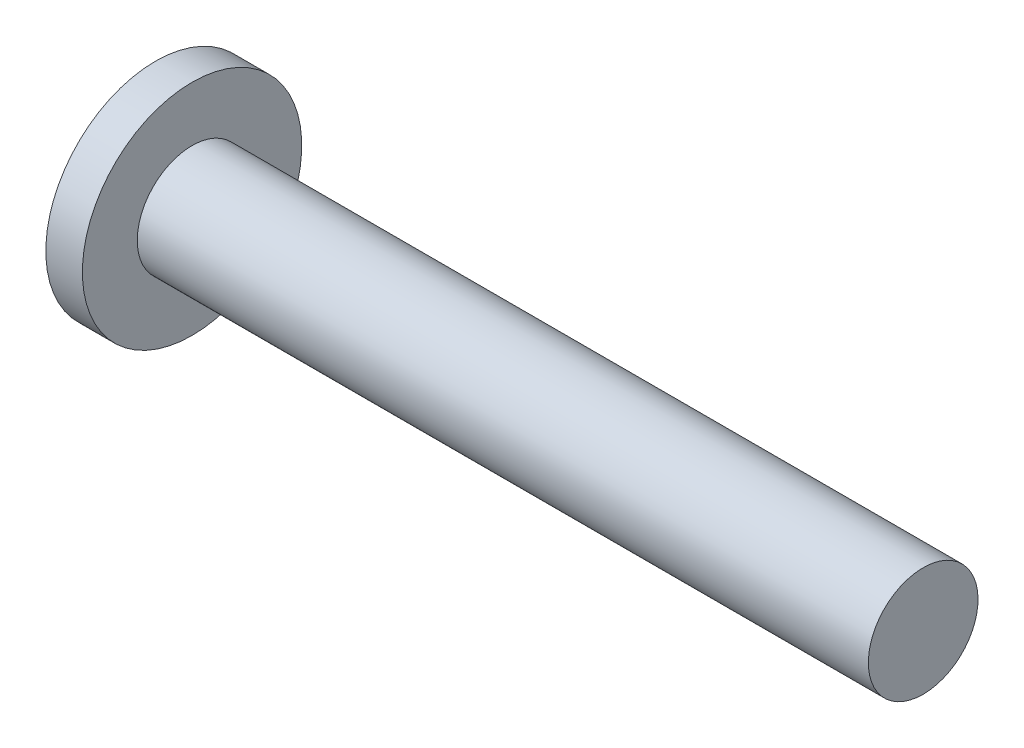
ISO-10303-21;
HEADER;
FILE_DESCRIPTION(('STEP AP214'),'2;1');
FILE_NAME('part.step','',(''),(''),'','','');
FILE_SCHEMA(('AUTOMOTIVE_DESIGN { 1 0 10303 214 1 1 1 1 }'));
ENDSEC;
DATA;
#1=APPLICATION_CONTEXT('core data for automotive mechanical design processes');
#2=APPLICATION_PROTOCOL_DEFINITION('international standard','automotive_design',2000,#1);
#3=PRODUCT_CONTEXT('',#1,'mechanical');
#4=PRODUCT('Part','Part','',(#3));
#5=PRODUCT_RELATED_PRODUCT_CATEGORY('part','',(#4));
#6=PRODUCT_DEFINITION_FORMATION('','',#4);
#7=PRODUCT_DEFINITION_CONTEXT('part definition',#1,'design');
#8=PRODUCT_DEFINITION('design','',#6,#7);
#9=PRODUCT_DEFINITION_SHAPE('','',#8);
#10=(LENGTH_UNIT() NAMED_UNIT(*) SI_UNIT(.MILLI.,.METRE.));
#11=(NAMED_UNIT(*) PLANE_ANGLE_UNIT() SI_UNIT($,.RADIAN.));
#12=(NAMED_UNIT(*) SI_UNIT($,.STERADIAN.) SOLID_ANGLE_UNIT());
#13=UNCERTAINTY_MEASURE_WITH_UNIT(LENGTH_MEASURE(1.E-05),#10,'distance_accuracy_value','');
#14=(GEOMETRIC_REPRESENTATION_CONTEXT(3) GLOBAL_UNCERTAINTY_ASSIGNED_CONTEXT((#13)) GLOBAL_UNIT_ASSIGNED_CONTEXT((#10,
#11,#12)) REPRESENTATION_CONTEXT('',''));
#15=CARTESIAN_POINT('',(0.,0.,0.));
#16=DIRECTION('',(0.,0.,1.));
#17=DIRECTION('',(1.,0.,0.));
#18=AXIS2_PLACEMENT_3D('',#15,#16,#17);
#19=CARTESIAN_POINT('',(0.,0.,0.));
#20=DIRECTION('',(-1.,0.,0.));
#21=DIRECTION('',(0.,-1.,0.));
#22=AXIS2_PLACEMENT_3D('',#19,#20,#21);
#23=PLANE('',#22);
#24=CARTESIAN_POINT('',(0.,-1.5,0.));
#25=DIRECTION('',(-1.,0.,0.));
#26=DIRECTION('',(0.,-1.,0.));
#27=AXIS2_PLACEMENT_3D('',#24,#25,#26);
#28=CIRCLE('',#27,3.);
#29=CARTESIAN_POINT('',(0.,-4.5,0.));
#30=VERTEX_POINT('',#29);
#31=EDGE_CURVE('E10',#30,#30,#28,.T.);
#32=ORIENTED_EDGE('',*,*,#31,.F.);
#33=EDGE_LOOP('',(#32));
#34=FACE_BOUND('',#33,.T.);
#35=CARTESIAN_POINT('',(0.,-1.5,0.));
#36=DIRECTION('',(-1.,0.,0.));
#37=DIRECTION('',(0.,-1.,0.));
#38=AXIS2_PLACEMENT_3D('',#35,#36,#37);
#39=CIRCLE('',#38,1.5);
#40=CARTESIAN_POINT('',(0.,-3.,0.));
#41=VERTEX_POINT('',#40);
#42=EDGE_CURVE('E51',#41,#41,#39,.T.);
#43=ORIENTED_EDGE('',*,*,#42,.T.);
#44=EDGE_LOOP('',(#43));
#45=FACE_BOUND('',#44,.T.);
#46=ADVANCED_FACE('F37',(#34,#45),#23,.F.);
#47=CARTESIAN_POINT('',(-1.,-1.5,0.));
#48=DIRECTION('',(-1.,0.,0.));
#49=DIRECTION('',(0.,-1.,0.));
#50=AXIS2_PLACEMENT_3D('',#47,#48,#49);
#51=CYLINDRICAL_SURFACE('',#50,3.);
#52=CARTESIAN_POINT('',(-1.,-1.5,0.));
#53=DIRECTION('',(-1.,0.,0.));
#54=DIRECTION('',(0.,-1.,0.));
#55=AXIS2_PLACEMENT_3D('',#52,#53,#54);
#56=CIRCLE('',#55,3.);
#57=CARTESIAN_POINT('',(-1.,-4.5,0.));
#58=VERTEX_POINT('',#57);
#59=EDGE_CURVE('E43',#58,#58,#56,.T.);
#60=ORIENTED_EDGE('',*,*,#59,.F.);
#61=EDGE_LOOP('',(#60));
#62=FACE_BOUND('',#61,.T.);
#63=ORIENTED_EDGE('',*,*,#31,.T.);
#64=EDGE_LOOP('',(#63));
#65=FACE_BOUND('',#64,.T.);
#66=ADVANCED_FACE('F71',(#62,#65),#51,.T.);
#67=CARTESIAN_POINT('',(-1.,1.5,0.));
#68=DIRECTION('',(1.,0.,0.));
#69=DIRECTION('',(0.,1.,0.));
#70=AXIS2_PLACEMENT_3D('',#67,#68,#69);
#71=PLANE('',#70);
#72=ORIENTED_EDGE('',*,*,#59,.T.);
#73=EDGE_LOOP('',(#72));
#74=FACE_BOUND('',#73,.T.);
#75=ADVANCED_FACE('F66',(#74),#71,.F.);
#76=CARTESIAN_POINT('',(20.,0.,0.));
#77=DIRECTION('',(-1.,0.,0.));
#78=DIRECTION('',(0.,-1.,0.));
#79=AXIS2_PLACEMENT_3D('',#76,#77,#78);
#80=PLANE('',#79);
#81=CARTESIAN_POINT('',(20.,-1.5,0.));
#82=DIRECTION('',(-1.,0.,0.));
#83=DIRECTION('',(0.,-1.,0.));
#84=AXIS2_PLACEMENT_3D('',#81,#82,#83);
#85=CIRCLE('',#84,1.5);
#86=CARTESIAN_POINT('',(20.,-3.,0.));
#87=VERTEX_POINT('',#86);
#88=EDGE_CURVE('E47',#87,#87,#85,.T.);
#89=ORIENTED_EDGE('',*,*,#88,.F.);
#90=EDGE_LOOP('',(#89));
#91=FACE_BOUND('',#90,.T.);
#92=ADVANCED_FACE('F61',(#91),#80,.F.);
#93=CARTESIAN_POINT('',(-1.,-1.5,0.));
#94=DIRECTION('',(-1.,0.,0.));
#95=DIRECTION('',(0.,-1.,0.));
#96=AXIS2_PLACEMENT_3D('',#93,#94,#95);
#97=CYLINDRICAL_SURFACE('',#96,1.5);
#98=ORIENTED_EDGE('',*,*,#42,.F.);
#99=EDGE_LOOP('',(#98));
#100=FACE_BOUND('',#99,.T.);
#101=ORIENTED_EDGE('',*,*,#88,.T.);
#102=EDGE_LOOP('',(#101));
#103=FACE_BOUND('',#102,.T.);
#104=ADVANCED_FACE('F58',(#100,#103),#97,.T.);
#105=CLOSED_SHELL('',(#46,#66,#75,#92,#104));
#106=MANIFOLD_SOLID_BREP('B2',#105);
#107=ADVANCED_BREP_SHAPE_REPRESENTATION('',(#18,#106),#14);
#108=SHAPE_DEFINITION_REPRESENTATION(#9,#107);
ENDSEC;
END-ISO-10303-21;
